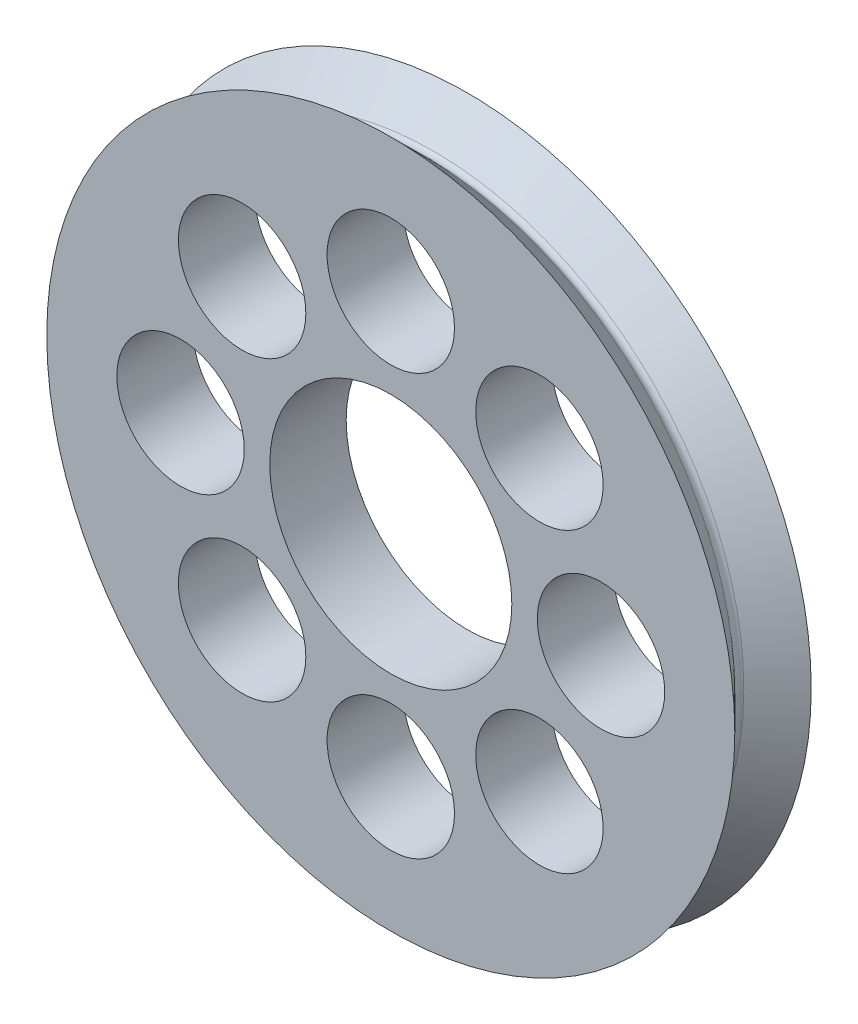
ISO-10303-21;
HEADER;
FILE_DESCRIPTION(('STEP AP214'),'2;1');
FILE_NAME('part.step','',(''),(''),'','','');
FILE_SCHEMA(('AUTOMOTIVE_DESIGN { 1 0 10303 214 1 1 1 1 }'));
ENDSEC;
DATA;
#1=APPLICATION_CONTEXT('core data for automotive mechanical design processes');
#2=APPLICATION_PROTOCOL_DEFINITION('international standard','automotive_design',2000,#1);
#3=PRODUCT_CONTEXT('',#1,'mechanical');
#4=PRODUCT('Part','Part','',(#3));
#5=PRODUCT_RELATED_PRODUCT_CATEGORY('part','',(#4));
#6=PRODUCT_DEFINITION_FORMATION('','',#4);
#7=PRODUCT_DEFINITION_CONTEXT('part definition',#1,'design');
#8=PRODUCT_DEFINITION('design','',#6,#7);
#9=PRODUCT_DEFINITION_SHAPE('','',#8);
#10=(LENGTH_UNIT() NAMED_UNIT(*) SI_UNIT(.MILLI.,.METRE.));
#11=(NAMED_UNIT(*) PLANE_ANGLE_UNIT() SI_UNIT($,.RADIAN.));
#12=(NAMED_UNIT(*) SI_UNIT($,.STERADIAN.) SOLID_ANGLE_UNIT());
#13=UNCERTAINTY_MEASURE_WITH_UNIT(LENGTH_MEASURE(1.E-05),#10,'distance_accuracy_value','');
#14=(GEOMETRIC_REPRESENTATION_CONTEXT(3) GLOBAL_UNCERTAINTY_ASSIGNED_CONTEXT((#13)) GLOBAL_UNIT_ASSIGNED_CONTEXT((#10,
#11,#12)) REPRESENTATION_CONTEXT('',''));
#15=CARTESIAN_POINT('',(0.,0.,0.));
#16=DIRECTION('',(0.,0.,1.));
#17=DIRECTION('',(1.,0.,0.));
#18=AXIS2_PLACEMENT_3D('',#15,#16,#17);
#19=CARTESIAN_POINT('',(0.,0.,0.));
#20=DIRECTION('',(0.,0.,1.));
#21=DIRECTION('',(1.,0.,0.));
#22=AXIS2_PLACEMENT_3D('',#19,#20,#21);
#23=TOROIDAL_SURFACE('',#22,24.7071067811866,0.499999999999998);
#24=CARTESIAN_POINT('',(0.,0.,-0.353553390593273));
#25=DIRECTION('',(0.,0.,1.));
#26=DIRECTION('',(1.,0.,0.));
#27=AXIS2_PLACEMENT_3D('',#24,#25,#26);
#28=CIRCLE('',#27,24.3535533905933);
#29=CARTESIAN_POINT('',(24.3535533905933,0.,-0.353553390593273));
#30=VERTEX_POINT('',#29);
#31=EDGE_CURVE('E10',#30,#30,#28,.T.);
#32=ORIENTED_EDGE('',*,*,#31,.T.);
#33=EDGE_LOOP('',(#32));
#34=FACE_BOUND('',#33,.T.);
#35=CARTESIAN_POINT('',(0.,0.,0.353553390593273));
#36=DIRECTION('',(0.,0.,1.));
#37=DIRECTION('',(1.,0.,0.));
#38=AXIS2_PLACEMENT_3D('',#35,#36,#37);
#39=CIRCLE('',#38,24.3535533905933);
#40=CARTESIAN_POINT('',(24.3535533905933,0.,0.353553390593273));
#41=VERTEX_POINT('',#40);
#42=EDGE_CURVE('E54',#41,#41,#39,.T.);
#43=ORIENTED_EDGE('',*,*,#42,.F.);
#44=EDGE_LOOP('',(#43));
#45=FACE_BOUND('',#44,.T.);
#46=ADVANCED_FACE('F32',(#34,#45),#23,.F.);
#47=CARTESIAN_POINT('',(0.,0.,-0.353553390593273));
#48=DIRECTION('',(0.,0.,-1.));
#49=DIRECTION('',(-1.,0.,0.));
#50=AXIS2_PLACEMENT_3D('',#47,#48,#49);
#51=CONICAL_SURFACE('',#50,24.3535533905933,0.785398163397447);
#52=CARTESIAN_POINT('',(0.,0.,-3.));
#53=DIRECTION('',(0.,0.,1.));
#54=DIRECTION('',(1.,0.,0.));
#55=AXIS2_PLACEMENT_3D('',#52,#53,#54);
#56=CIRCLE('',#55,27.);
#57=CARTESIAN_POINT('',(27.,0.,-3.));
#58=VERTEX_POINT('',#57);
#59=EDGE_CURVE('E38',#58,#58,#56,.T.);
#60=ORIENTED_EDGE('',*,*,#59,.T.);
#61=EDGE_LOOP('',(#60));
#62=FACE_BOUND('',#61,.T.);
#63=ORIENTED_EDGE('',*,*,#31,.F.);
#64=EDGE_LOOP('',(#63));
#65=FACE_BOUND('',#64,.T.);
#66=ADVANCED_FACE('F140',(#62,#65),#51,.T.);
#67=CARTESIAN_POINT('',(27.,0.,-3.));
#68=DIRECTION('',(0.,0.,-1.));
#69=DIRECTION('',(-1.,0.,0.));
#70=AXIS2_PLACEMENT_3D('',#67,#68,#69);
#71=PLANE('',#70);
#72=CARTESIAN_POINT('',(11.6672618895782,11.6672618895779,-3.));
#73=DIRECTION('',(0.,0.,-1.));
#74=DIRECTION('',(-1.,0.,0.));
#75=AXIS2_PLACEMENT_3D('',#72,#73,#74);
#76=CIRCLE('',#75,5.);
#77=CARTESIAN_POINT('',(6.66726188957818,11.6672618895779,-3.));
#78=VERTEX_POINT('',#77);
#79=EDGE_CURVE('E99',#78,#78,#76,.T.);
#80=ORIENTED_EDGE('',*,*,#79,.F.);
#81=EDGE_LOOP('',(#80));
#82=FACE_BOUND('',#81,.T.);
#83=CARTESIAN_POINT('',(1.72828326272735E-13,16.5,-3.));
#84=DIRECTION('',(0.,0.,-1.));
#85=DIRECTION('',(-1.,0.,0.));
#86=AXIS2_PLACEMENT_3D('',#83,#84,#85);
#87=CIRCLE('',#86,5.);
#88=CARTESIAN_POINT('',(-4.99999999999983,16.5,-3.));
#89=VERTEX_POINT('',#88);
#90=EDGE_CURVE('E93',#89,#89,#87,.T.);
#91=ORIENTED_EDGE('',*,*,#90,.F.);
#92=EDGE_LOOP('',(#91));
#93=FACE_BOUND('',#92,.T.);
#94=CARTESIAN_POINT('',(-11.6672618895779,11.6672618895781,-3.));
#95=DIRECTION('',(0.,0.,-1.));
#96=DIRECTION('',(-1.,0.,0.));
#97=AXIS2_PLACEMENT_3D('',#94,#95,#96);
#98=CIRCLE('',#97,5.);
#99=CARTESIAN_POINT('',(-16.6672618895779,11.6672618895781,-3.));
#100=VERTEX_POINT('',#99);
#101=EDGE_CURVE('E87',#100,#100,#98,.T.);
#102=ORIENTED_EDGE('',*,*,#101,.F.);
#103=EDGE_LOOP('',(#102));
#104=FACE_BOUND('',#103,.T.);
#105=CARTESIAN_POINT('',(-16.5,1.15218884181823E-13,-3.));
#106=DIRECTION('',(0.,0.,-1.));
#107=DIRECTION('',(-1.,0.,0.));
#108=AXIS2_PLACEMENT_3D('',#105,#106,#107);
#109=CIRCLE('',#108,5.);
#110=CARTESIAN_POINT('',(-21.5,1.15218884181823E-13,-3.));
#111=VERTEX_POINT('',#110);
#112=EDGE_CURVE('E81',#111,#111,#109,.T.);
#113=ORIENTED_EDGE('',*,*,#112,.F.);
#114=EDGE_LOOP('',(#113));
#115=FACE_BOUND('',#114,.T.);
#116=CARTESIAN_POINT('',(-11.6672618895781,-11.667261889578,-3.));
#117=DIRECTION('',(0.,0.,-1.));
#118=DIRECTION('',(-1.,0.,0.));
#119=AXIS2_PLACEMENT_3D('',#116,#117,#118);
#120=CIRCLE('',#119,5.);
#121=CARTESIAN_POINT('',(-16.6672618895781,-11.667261889578,-3.));
#122=VERTEX_POINT('',#121);
#123=EDGE_CURVE('E75',#122,#122,#120,.T.);
#124=ORIENTED_EDGE('',*,*,#123,.F.);
#125=EDGE_LOOP('',(#124));
#126=FACE_BOUND('',#125,.T.);
#127=CARTESIAN_POINT('',(0.,-16.5,-3.));
#128=DIRECTION('',(0.,0.,-1.));
#129=DIRECTION('',(-1.,0.,0.));
#130=AXIS2_PLACEMENT_3D('',#127,#128,#129);
#131=CIRCLE('',#130,5.);
#132=CARTESIAN_POINT('',(-5.00000000000006,-16.5,-3.));
#133=VERTEX_POINT('',#132);
#134=EDGE_CURVE('E69',#133,#133,#131,.T.);
#135=ORIENTED_EDGE('',*,*,#134,.F.);
#136=EDGE_LOOP('',(#135));
#137=FACE_BOUND('',#136,.T.);
#138=CARTESIAN_POINT('',(11.667261889578,-11.6672618895781,-3.));
#139=DIRECTION('',(0.,0.,-1.));
#140=DIRECTION('',(-1.,0.,0.));
#141=AXIS2_PLACEMENT_3D('',#138,#139,#140);
#142=CIRCLE('',#141,5.);
#143=CARTESIAN_POINT('',(6.66726188957801,-11.6672618895781,-3.));
#144=VERTEX_POINT('',#143);
#145=EDGE_CURVE('E63',#144,#144,#142,.T.);
#146=ORIENTED_EDGE('',*,*,#145,.F.);
#147=EDGE_LOOP('',(#146));
#148=FACE_BOUND('',#147,.T.);
#149=CARTESIAN_POINT('',(16.5,0.,-3.));
#150=DIRECTION('',(0.,0.,-1.));
#151=DIRECTION('',(-1.,0.,0.));
#152=AXIS2_PLACEMENT_3D('',#149,#150,#151);
#153=CIRCLE('',#152,5.);
#154=CARTESIAN_POINT('',(11.5,0.,-3.));
#155=VERTEX_POINT('',#154);
#156=EDGE_CURVE('E57',#155,#155,#153,.T.);
#157=ORIENTED_EDGE('',*,*,#156,.F.);
#158=EDGE_LOOP('',(#157));
#159=FACE_BOUND('',#158,.T.);
#160=CARTESIAN_POINT('',(0.,0.,-3.));
#161=DIRECTION('',(0.,0.,1.));
#162=DIRECTION('',(1.,0.,0.));
#163=AXIS2_PLACEMENT_3D('',#160,#161,#162);
#164=CIRCLE('',#163,9.49999999999999);
#165=CARTESIAN_POINT('',(9.49999999999999,0.,-3.));
#166=VERTEX_POINT('',#165);
#167=EDGE_CURVE('E42',#166,#166,#164,.T.);
#168=ORIENTED_EDGE('',*,*,#167,.T.);
#169=EDGE_LOOP('',(#168));
#170=FACE_BOUND('',#169,.T.);
#171=ORIENTED_EDGE('',*,*,#59,.F.);
#172=EDGE_LOOP('',(#171));
#173=FACE_BOUND('',#172,.T.);
#174=ADVANCED_FACE('F134',(#82,#93,#104,#115,#126,#137,#148,#159,#170,#173),#71,.T.);
#175=CARTESIAN_POINT('',(0.,0.,0.));
#176=DIRECTION('',(0.,0.,1.));
#177=DIRECTION('',(1.,0.,0.));
#178=AXIS2_PLACEMENT_3D('',#175,#176,#177);
#179=CYLINDRICAL_SURFACE('',#178,9.49999999999999);
#180=CARTESIAN_POINT('',(0.,0.,3.));
#181=DIRECTION('',(0.,0.,1.));
#182=DIRECTION('',(1.,0.,0.));
#183=AXIS2_PLACEMENT_3D('',#180,#181,#182);
#184=CIRCLE('',#183,9.49999999999999);
#185=CARTESIAN_POINT('',(9.49999999999999,0.,3.));
#186=VERTEX_POINT('',#185);
#187=EDGE_CURVE('E46',#186,#186,#184,.T.);
#188=ORIENTED_EDGE('',*,*,#187,.T.);
#189=EDGE_LOOP('',(#188));
#190=FACE_BOUND('',#189,.T.);
#191=ORIENTED_EDGE('',*,*,#167,.F.);
#192=EDGE_LOOP('',(#191));
#193=FACE_BOUND('',#192,.T.);
#194=ADVANCED_FACE('F112',(#190,#193),#179,.F.);
#195=CARTESIAN_POINT('',(9.49999999999999,0.,3.));
#196=DIRECTION('',(0.,0.,1.));
#197=DIRECTION('',(1.,0.,0.));
#198=AXIS2_PLACEMENT_3D('',#195,#196,#197);
#199=PLANE('',#198);
#200=CARTESIAN_POINT('',(11.6672618895782,11.6672618895779,3.));
#201=DIRECTION('',(0.,0.,1.));
#202=DIRECTION('',(1.,0.,0.));
#203=AXIS2_PLACEMENT_3D('',#200,#201,#202);
#204=CIRCLE('',#203,5.);
#205=CARTESIAN_POINT('',(16.6672618895782,11.6672618895779,3.));
#206=VERTEX_POINT('',#205);
#207=EDGE_CURVE('E102',#206,#206,#204,.T.);
#208=ORIENTED_EDGE('',*,*,#207,.F.);
#209=EDGE_LOOP('',(#208));
#210=FACE_BOUND('',#209,.T.);
#211=CARTESIAN_POINT('',(1.72828326272735E-13,16.5,3.));
#212=DIRECTION('',(0.,0.,1.));
#213=DIRECTION('',(1.,0.,0.));
#214=AXIS2_PLACEMENT_3D('',#211,#212,#213);
#215=CIRCLE('',#214,5.);
#216=CARTESIAN_POINT('',(5.00000000000017,16.5,3.));
#217=VERTEX_POINT('',#216);
#218=EDGE_CURVE('E96',#217,#217,#215,.T.);
#219=ORIENTED_EDGE('',*,*,#218,.F.);
#220=EDGE_LOOP('',(#219));
#221=FACE_BOUND('',#220,.T.);
#222=CARTESIAN_POINT('',(-11.6672618895779,11.6672618895781,3.));
#223=DIRECTION('',(0.,0.,1.));
#224=DIRECTION('',(1.,0.,0.));
#225=AXIS2_PLACEMENT_3D('',#222,#223,#224);
#226=CIRCLE('',#225,5.);
#227=CARTESIAN_POINT('',(-6.66726188957793,11.6672618895781,3.));
#228=VERTEX_POINT('',#227);
#229=EDGE_CURVE('E90',#228,#228,#226,.T.);
#230=ORIENTED_EDGE('',*,*,#229,.F.);
#231=EDGE_LOOP('',(#230));
#232=FACE_BOUND('',#231,.T.);
#233=CARTESIAN_POINT('',(-16.5,1.15218884181823E-13,3.));
#234=DIRECTION('',(0.,0.,1.));
#235=DIRECTION('',(1.,0.,0.));
#236=AXIS2_PLACEMENT_3D('',#233,#234,#235);
#237=CIRCLE('',#236,5.);
#238=CARTESIAN_POINT('',(-11.5,1.15218884181823E-13,3.));
#239=VERTEX_POINT('',#238);
#240=EDGE_CURVE('E84',#239,#239,#237,.T.);
#241=ORIENTED_EDGE('',*,*,#240,.F.);
#242=EDGE_LOOP('',(#241));
#243=FACE_BOUND('',#242,.T.);
#244=CARTESIAN_POINT('',(-11.6672618895781,-11.667261889578,3.));
#245=DIRECTION('',(0.,0.,1.));
#246=DIRECTION('',(1.,0.,0.));
#247=AXIS2_PLACEMENT_3D('',#244,#245,#246);
#248=CIRCLE('',#247,5.);
#249=CARTESIAN_POINT('',(-6.66726188957809,-11.667261889578,3.));
#250=VERTEX_POINT('',#249);
#251=EDGE_CURVE('E78',#250,#250,#248,.T.);
#252=ORIENTED_EDGE('',*,*,#251,.F.);
#253=EDGE_LOOP('',(#252));
#254=FACE_BOUND('',#253,.T.);
#255=CARTESIAN_POINT('',(0.,-16.5,3.));
#256=DIRECTION('',(0.,0.,1.));
#257=DIRECTION('',(1.,0.,0.));
#258=AXIS2_PLACEMENT_3D('',#255,#256,#257);
#259=CIRCLE('',#258,5.);
#260=CARTESIAN_POINT('',(4.99999999999994,-16.5,3.));
#261=VERTEX_POINT('',#260);
#262=EDGE_CURVE('E72',#261,#261,#259,.T.);
#263=ORIENTED_EDGE('',*,*,#262,.F.);
#264=EDGE_LOOP('',(#263));
#265=FACE_BOUND('',#264,.T.);
#266=CARTESIAN_POINT('',(11.667261889578,-11.6672618895781,3.));
#267=DIRECTION('',(0.,0.,1.));
#268=DIRECTION('',(1.,0.,0.));
#269=AXIS2_PLACEMENT_3D('',#266,#267,#268);
#270=CIRCLE('',#269,5.);
#271=CARTESIAN_POINT('',(16.667261889578,-11.6672618895781,3.));
#272=VERTEX_POINT('',#271);
#273=EDGE_CURVE('E66',#272,#272,#270,.T.);
#274=ORIENTED_EDGE('',*,*,#273,.F.);
#275=EDGE_LOOP('',(#274));
#276=FACE_BOUND('',#275,.T.);
#277=CARTESIAN_POINT('',(16.5,0.,3.));
#278=DIRECTION('',(0.,0.,1.));
#279=DIRECTION('',(1.,0.,0.));
#280=AXIS2_PLACEMENT_3D('',#277,#278,#279);
#281=CIRCLE('',#280,5.);
#282=CARTESIAN_POINT('',(21.5,0.,3.));
#283=VERTEX_POINT('',#282);
#284=EDGE_CURVE('E60',#283,#283,#281,.T.);
#285=ORIENTED_EDGE('',*,*,#284,.F.);
#286=EDGE_LOOP('',(#285));
#287=FACE_BOUND('',#286,.T.);
#288=CARTESIAN_POINT('',(0.,0.,3.));
#289=DIRECTION('',(0.,0.,1.));
#290=DIRECTION('',(1.,0.,0.));
#291=AXIS2_PLACEMENT_3D('',#288,#289,#290);
#292=CIRCLE('',#291,27.);
#293=CARTESIAN_POINT('',(27.,0.,3.));
#294=VERTEX_POINT('',#293);
#295=EDGE_CURVE('E51',#294,#294,#292,.T.);
#296=ORIENTED_EDGE('',*,*,#295,.T.);
#297=EDGE_LOOP('',(#296));
#298=FACE_BOUND('',#297,.T.);
#299=ORIENTED_EDGE('',*,*,#187,.F.);
#300=EDGE_LOOP('',(#299));
#301=FACE_BOUND('',#300,.T.);
#302=ADVANCED_FACE('F108',(#210,#221,#232,#243,#254,#265,#276,#287,#298,#301),#199,.T.);
#303=CARTESIAN_POINT('',(0.,0.,3.));
#304=DIRECTION('',(0.,0.,1.));
#305=DIRECTION('',(1.,0.,0.));
#306=AXIS2_PLACEMENT_3D('',#303,#304,#305);
#307=CONICAL_SURFACE('',#306,27.,0.785398163397447);
#308=ORIENTED_EDGE('',*,*,#42,.T.);
#309=EDGE_LOOP('',(#308));
#310=FACE_BOUND('',#309,.T.);
#311=ORIENTED_EDGE('',*,*,#295,.F.);
#312=EDGE_LOOP('',(#311));
#313=FACE_BOUND('',#312,.T.);
#314=ADVANCED_FACE('F111',(#310,#313),#307,.T.);
#315=CARTESIAN_POINT('',(16.5,0.,-7.));
#316=DIRECTION('',(0.,0.,1.));
#317=DIRECTION('',(1.,0.,0.));
#318=AXIS2_PLACEMENT_3D('',#315,#316,#317);
#319=CYLINDRICAL_SURFACE('',#318,5.);
#320=ORIENTED_EDGE('',*,*,#156,.T.);
#321=EDGE_LOOP('',(#320));
#322=FACE_BOUND('',#321,.T.);
#323=ORIENTED_EDGE('',*,*,#284,.T.);
#324=EDGE_LOOP('',(#323));
#325=FACE_BOUND('',#324,.T.);
#326=ADVANCED_FACE('F156',(#322,#325),#319,.F.);
#327=CARTESIAN_POINT('',(11.667261889578,-11.6672618895781,-7.));
#328=DIRECTION('',(0.,0.,1.));
#329=DIRECTION('',(1.,0.,0.));
#330=AXIS2_PLACEMENT_3D('',#327,#328,#329);
#331=CYLINDRICAL_SURFACE('',#330,5.);
#332=ORIENTED_EDGE('',*,*,#145,.T.);
#333=EDGE_LOOP('',(#332));
#334=FACE_BOUND('',#333,.T.);
#335=ORIENTED_EDGE('',*,*,#273,.T.);
#336=EDGE_LOOP('',(#335));
#337=FACE_BOUND('',#336,.T.);
#338=ADVANCED_FACE('F161',(#334,#337),#331,.F.);
#339=CARTESIAN_POINT('',(0.,-16.5,-7.));
#340=DIRECTION('',(0.,0.,1.));
#341=DIRECTION('',(1.,0.,0.));
#342=AXIS2_PLACEMENT_3D('',#339,#340,#341);
#343=CYLINDRICAL_SURFACE('',#342,5.);
#344=ORIENTED_EDGE('',*,*,#134,.T.);
#345=EDGE_LOOP('',(#344));
#346=FACE_BOUND('',#345,.T.);
#347=ORIENTED_EDGE('',*,*,#262,.T.);
#348=EDGE_LOOP('',(#347));
#349=FACE_BOUND('',#348,.T.);
#350=ADVANCED_FACE('F167',(#346,#349),#343,.F.);
#351=CARTESIAN_POINT('',(-11.6672618895781,-11.667261889578,-7.));
#352=DIRECTION('',(0.,0.,1.));
#353=DIRECTION('',(1.,0.,0.));
#354=AXIS2_PLACEMENT_3D('',#351,#352,#353);
#355=CYLINDRICAL_SURFACE('',#354,5.);
#356=ORIENTED_EDGE('',*,*,#123,.T.);
#357=EDGE_LOOP('',(#356));
#358=FACE_BOUND('',#357,.T.);
#359=ORIENTED_EDGE('',*,*,#251,.T.);
#360=EDGE_LOOP('',(#359));
#361=FACE_BOUND('',#360,.T.);
#362=ADVANCED_FACE('F171',(#358,#361),#355,.F.);
#363=CARTESIAN_POINT('',(-16.5,1.15218884181823E-13,-7.));
#364=DIRECTION('',(0.,0.,1.));
#365=DIRECTION('',(1.,0.,0.));
#366=AXIS2_PLACEMENT_3D('',#363,#364,#365);
#367=CYLINDRICAL_SURFACE('',#366,5.);
#368=ORIENTED_EDGE('',*,*,#112,.T.);
#369=EDGE_LOOP('',(#368));
#370=FACE_BOUND('',#369,.T.);
#371=ORIENTED_EDGE('',*,*,#240,.T.);
#372=EDGE_LOOP('',(#371));
#373=FACE_BOUND('',#372,.T.);
#374=ADVANCED_FACE('F175',(#370,#373),#367,.F.);
#375=CARTESIAN_POINT('',(-11.6672618895779,11.6672618895781,-7.));
#376=DIRECTION('',(0.,0.,1.));
#377=DIRECTION('',(1.,0.,0.));
#378=AXIS2_PLACEMENT_3D('',#375,#376,#377);
#379=CYLINDRICAL_SURFACE('',#378,5.);
#380=ORIENTED_EDGE('',*,*,#101,.T.);
#381=EDGE_LOOP('',(#380));
#382=FACE_BOUND('',#381,.T.);
#383=ORIENTED_EDGE('',*,*,#229,.T.);
#384=EDGE_LOOP('',(#383));
#385=FACE_BOUND('',#384,.T.);
#386=ADVANCED_FACE('F179',(#382,#385),#379,.F.);
#387=CARTESIAN_POINT('',(1.72828326272735E-13,16.5,-7.));
#388=DIRECTION('',(0.,0.,1.));
#389=DIRECTION('',(1.,0.,0.));
#390=AXIS2_PLACEMENT_3D('',#387,#388,#389);
#391=CYLINDRICAL_SURFACE('',#390,5.);
#392=ORIENTED_EDGE('',*,*,#90,.T.);
#393=EDGE_LOOP('',(#392));
#394=FACE_BOUND('',#393,.T.);
#395=ORIENTED_EDGE('',*,*,#218,.T.);
#396=EDGE_LOOP('',(#395));
#397=FACE_BOUND('',#396,.T.);
#398=ADVANCED_FACE('F183',(#394,#397),#391,.F.);
#399=CARTESIAN_POINT('',(11.6672618895782,11.6672618895779,-7.));
#400=DIRECTION('',(0.,0.,1.));
#401=DIRECTION('',(1.,0.,0.));
#402=AXIS2_PLACEMENT_3D('',#399,#400,#401);
#403=CYLINDRICAL_SURFACE('',#402,5.);
#404=ORIENTED_EDGE('',*,*,#79,.T.);
#405=EDGE_LOOP('',(#404));
#406=FACE_BOUND('',#405,.T.);
#407=ORIENTED_EDGE('',*,*,#207,.T.);
#408=EDGE_LOOP('',(#407));
#409=FACE_BOUND('',#408,.T.);
#410=ADVANCED_FACE('F106',(#406,#409),#403,.F.);
#411=CLOSED_SHELL('',(#46,#66,#174,#194,#302,#314,#326,#338,#350,#362,#374,#386,#398,#410));
#412=MANIFOLD_SOLID_BREP('B2',#411);
#413=ADVANCED_BREP_SHAPE_REPRESENTATION('',(#18,#412),#14);
#414=SHAPE_DEFINITION_REPRESENTATION(#9,#413);
ENDSEC;
END-ISO-10303-21;
